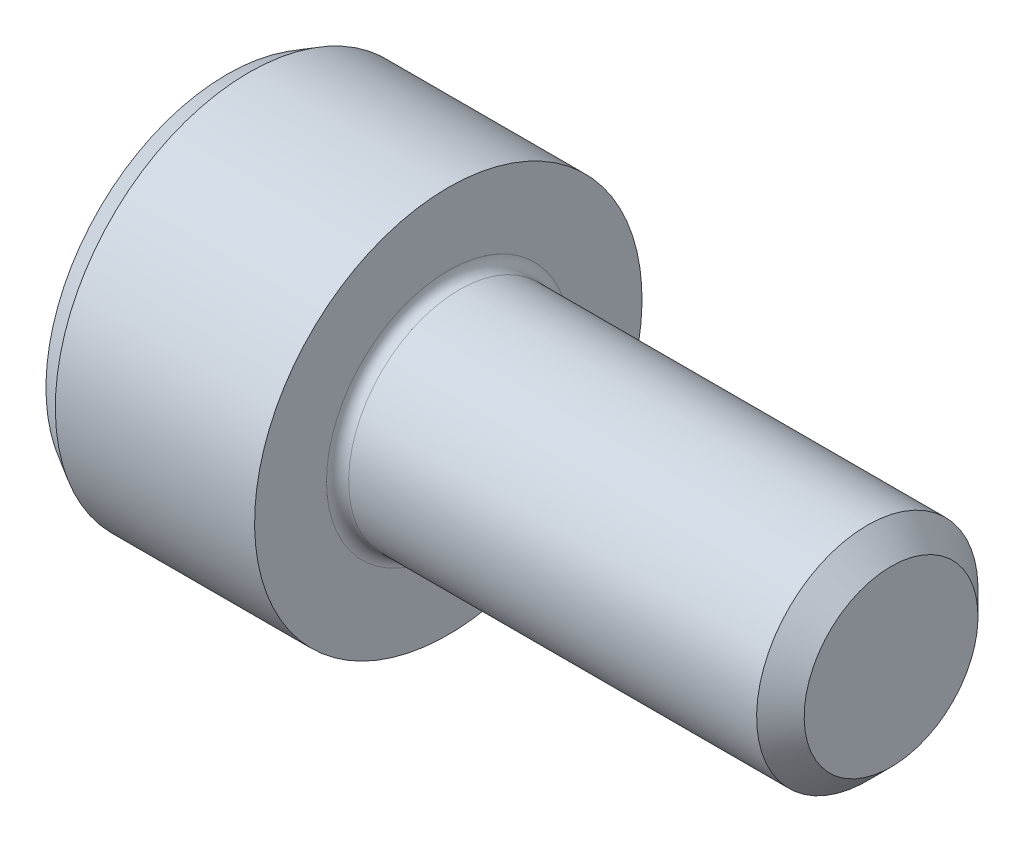
ISO-10303-21;
HEADER;
FILE_DESCRIPTION(('STEP AP214'),'2;1');
FILE_NAME('part.step','',(''),(''),'','','');
FILE_SCHEMA(('AUTOMOTIVE_DESIGN { 1 0 10303 214 1 1 1 1 }'));
ENDSEC;
DATA;
#1=APPLICATION_CONTEXT('core data for automotive mechanical design processes');
#2=APPLICATION_PROTOCOL_DEFINITION('international standard','automotive_design',2000,#1);
#3=PRODUCT_CONTEXT('',#1,'mechanical');
#4=PRODUCT('Part','Part','',(#3));
#5=PRODUCT_RELATED_PRODUCT_CATEGORY('part','',(#4));
#6=PRODUCT_DEFINITION_FORMATION('','',#4);
#7=PRODUCT_DEFINITION_CONTEXT('part definition',#1,'design');
#8=PRODUCT_DEFINITION('design','',#6,#7);
#9=PRODUCT_DEFINITION_SHAPE('','',#8);
#10=(LENGTH_UNIT() NAMED_UNIT(*) SI_UNIT(.MILLI.,.METRE.));
#11=(NAMED_UNIT(*) PLANE_ANGLE_UNIT() SI_UNIT($,.RADIAN.));
#12=(NAMED_UNIT(*) SI_UNIT($,.STERADIAN.) SOLID_ANGLE_UNIT());
#13=UNCERTAINTY_MEASURE_WITH_UNIT(LENGTH_MEASURE(1.E-05),#10,'distance_accuracy_value','');
#14=(GEOMETRIC_REPRESENTATION_CONTEXT(3) GLOBAL_UNCERTAINTY_ASSIGNED_CONTEXT((#13)) GLOBAL_UNIT_ASSIGNED_CONTEXT((#10,
#11,#12)) REPRESENTATION_CONTEXT('',''));
#15=CARTESIAN_POINT('',(0.,0.,0.));
#16=DIRECTION('',(0.,0.,1.));
#17=DIRECTION('',(1.,0.,0.));
#18=AXIS2_PLACEMENT_3D('',#15,#16,#17);
#19=CARTESIAN_POINT('',(0.,3.5,0.));
#20=DIRECTION('',(-1.,0.,0.));
#21=DIRECTION('',(0.,0.,1.));
#22=AXIS2_PLACEMENT_3D('',#19,#20,#21);
#23=PLANE('',#22);
#24=CARTESIAN_POINT('',(0.,0.,0.));
#25=DIRECTION('',(1.,0.,0.));
#26=DIRECTION('',(0.,1.,0.));
#27=AXIS2_PLACEMENT_3D('',#24,#25,#26);
#28=CIRCLE('',#27,2.2);
#29=CARTESIAN_POINT('',(0.,2.2,0.));
#30=VERTEX_POINT('',#29);
#31=EDGE_CURVE('E10',#30,#30,#28,.T.);
#32=ORIENTED_EDGE('',*,*,#31,.F.);
#33=EDGE_LOOP('',(#32));
#34=FACE_BOUND('',#33,.T.);
#35=CARTESIAN_POINT('',(0.,0.,0.));
#36=DIRECTION('',(1.,0.,0.));
#37=DIRECTION('',(0.,1.,0.));
#38=AXIS2_PLACEMENT_3D('',#35,#36,#37);
#39=CIRCLE('',#38,3.5);
#40=CARTESIAN_POINT('',(0.,3.5,0.));
#41=VERTEX_POINT('',#40);
#42=EDGE_CURVE('E213',#41,#41,#39,.T.);
#43=ORIENTED_EDGE('',*,*,#42,.T.);
#44=EDGE_LOOP('',(#43));
#45=FACE_BOUND('',#44,.T.);
#46=ADVANCED_FACE('F16',(#34,#45),#23,.F.);
#47=CARTESIAN_POINT('',(0.2,0.,0.));
#48=DIRECTION('',(1.,0.,0.));
#49=DIRECTION('',(0.,1.,0.));
#50=AXIS2_PLACEMENT_3D('',#47,#48,#49);
#51=TOROIDAL_SURFACE('',#50,2.2,0.2);
#52=CARTESIAN_POINT('',(0.2,0.,0.));
#53=DIRECTION('',(1.,0.,0.));
#54=DIRECTION('',(0.,1.,0.));
#55=AXIS2_PLACEMENT_3D('',#52,#53,#54);
#56=CIRCLE('',#55,2.);
#57=CARTESIAN_POINT('',(0.2,2.,0.));
#58=VERTEX_POINT('',#57);
#59=EDGE_CURVE('E27',#58,#58,#56,.T.);
#60=ORIENTED_EDGE('',*,*,#59,.F.);
#61=EDGE_LOOP('',(#60));
#62=FACE_BOUND('',#61,.T.);
#63=ORIENTED_EDGE('',*,*,#31,.T.);
#64=EDGE_LOOP('',(#63));
#65=FACE_BOUND('',#64,.T.);
#66=ADVANCED_FACE('F380',(#62,#65),#51,.F.);
#67=CARTESIAN_POINT('',(8.,0.,0.));
#68=DIRECTION('',(-1.,0.,0.));
#69=DIRECTION('',(0.,1.,0.));
#70=AXIS2_PLACEMENT_3D('',#67,#68,#69);
#71=CYLINDRICAL_SURFACE('',#70,2.);
#72=CARTESIAN_POINT('',(7.5705,0.,0.));
#73=DIRECTION('',(1.,0.,0.));
#74=DIRECTION('',(0.,1.,0.));
#75=AXIS2_PLACEMENT_3D('',#72,#73,#74);
#76=CIRCLE('',#75,2.);
#77=CARTESIAN_POINT('',(7.5705,2.,0.));
#78=VERTEX_POINT('',#77);
#79=EDGE_CURVE('E180',#78,#78,#76,.T.);
#80=ORIENTED_EDGE('',*,*,#79,.F.);
#81=EDGE_LOOP('',(#80));
#82=FACE_BOUND('',#81,.T.);
#83=ORIENTED_EDGE('',*,*,#59,.T.);
#84=EDGE_LOOP('',(#83));
#85=FACE_BOUND('',#84,.T.);
#86=ADVANCED_FACE('F386',(#82,#85),#71,.T.);
#87=CARTESIAN_POINT('',(7.5705,0.,0.));
#88=DIRECTION('',(-1.,0.,0.));
#89=DIRECTION('',(0.,-1.,0.));
#90=AXIS2_PLACEMENT_3D('',#87,#88,#89);
#91=CONICAL_SURFACE('',#90,2.,0.785398163397447);
#92=CARTESIAN_POINT('',(8.,0.,0.));
#93=DIRECTION('',(1.,0.,0.));
#94=DIRECTION('',(0.,1.,0.));
#95=AXIS2_PLACEMENT_3D('',#92,#93,#94);
#96=CIRCLE('',#95,1.5705);
#97=CARTESIAN_POINT('',(8.,1.5705,0.));
#98=VERTEX_POINT('',#97);
#99=EDGE_CURVE('E153',#98,#98,#96,.T.);
#100=ORIENTED_EDGE('',*,*,#99,.F.);
#101=EDGE_LOOP('',(#100));
#102=FACE_BOUND('',#101,.T.);
#103=ORIENTED_EDGE('',*,*,#79,.T.);
#104=EDGE_LOOP('',(#103));
#105=FACE_BOUND('',#104,.T.);
#106=ADVANCED_FACE('F412',(#102,#105),#91,.T.);
#107=CARTESIAN_POINT('',(8.,1.5705,0.));
#108=DIRECTION('',(-1.,0.,0.));
#109=DIRECTION('',(0.,0.,1.));
#110=AXIS2_PLACEMENT_3D('',#107,#108,#109);
#111=PLANE('',#110);
#112=ORIENTED_EDGE('',*,*,#99,.T.);
#113=EDGE_LOOP('',(#112));
#114=FACE_BOUND('',#113,.T.);
#115=ADVANCED_FACE('F398',(#114),#111,.F.);
#116=CARTESIAN_POINT('',(-2.,0.,0.));
#117=DIRECTION('',(-1.,0.,0.));
#118=DIRECTION('',(0.,0.,1.));
#119=AXIS2_PLACEMENT_3D('',#116,#117,#118);
#120=CONICAL_SURFACE('',#119,1.5,1.0471975511966);
#121=CARTESIAN_POINT('',(-1.13397459621555,0.,0.));
#122=VERTEX_POINT('',#121);
#123=VERTEX_LOOP('',#122);
#124=FACE_BOUND('',#123,.T.);
#125=CARTESIAN_POINT('',(-2.,0.,0.));
#126=DIRECTION('',(1.,0.,0.));
#127=DIRECTION('',(0.,0.,-1.));
#128=AXIS2_PLACEMENT_3D('',#125,#126,#127);
#129=CIRCLE('',#128,1.5);
#130=CARTESIAN_POINT('',(-2.,1.29903810567666,-0.75));
#131=VERTEX_POINT('',#130);
#132=CARTESIAN_POINT('',(-2.,1.29903810567666,0.75));
#133=VERTEX_POINT('',#132);
#134=EDGE_CURVE('E179',#131,#133,#129,.T.);
#135=ORIENTED_EDGE('',*,*,#134,.F.);
#136=CARTESIAN_POINT('',(-2.,0.,0.));
#137=DIRECTION('',(1.,0.,0.));
#138=DIRECTION('',(0.,0.,-1.));
#139=AXIS2_PLACEMENT_3D('',#136,#137,#138);
#140=CIRCLE('',#139,1.5);
#141=CARTESIAN_POINT('',(-2.,0.,-1.5));
#142=VERTEX_POINT('',#141);
#143=EDGE_CURVE('E20',#142,#131,#140,.T.);
#144=ORIENTED_EDGE('',*,*,#143,.F.);
#145=CARTESIAN_POINT('',(-2.,0.,0.));
#146=DIRECTION('',(1.,0.,0.));
#147=DIRECTION('',(0.,0.,-1.));
#148=AXIS2_PLACEMENT_3D('',#145,#146,#147);
#149=CIRCLE('',#148,1.5);
#150=CARTESIAN_POINT('',(-2.,-1.29903810567666,-0.75));
#151=VERTEX_POINT('',#150);
#152=EDGE_CURVE('E178',#151,#142,#149,.T.);
#153=ORIENTED_EDGE('',*,*,#152,.F.);
#154=CARTESIAN_POINT('',(-2.,0.,0.));
#155=DIRECTION('',(1.,0.,0.));
#156=DIRECTION('',(0.,0.,-1.));
#157=AXIS2_PLACEMENT_3D('',#154,#155,#156);
#158=CIRCLE('',#157,1.5);
#159=CARTESIAN_POINT('',(-2.,-1.29903810567666,0.75));
#160=VERTEX_POINT('',#159);
#161=EDGE_CURVE('E167',#160,#151,#158,.T.);
#162=ORIENTED_EDGE('',*,*,#161,.F.);
#163=CARTESIAN_POINT('',(-2.,0.,0.));
#164=DIRECTION('',(1.,0.,0.));
#165=DIRECTION('',(0.,0.,-1.));
#166=AXIS2_PLACEMENT_3D('',#163,#164,#165);
#167=CIRCLE('',#166,1.5);
#168=CARTESIAN_POINT('',(-2.,0.,1.5));
#169=VERTEX_POINT('',#168);
#170=EDGE_CURVE('E177',#169,#160,#167,.T.);
#171=ORIENTED_EDGE('',*,*,#170,.F.);
#172=CARTESIAN_POINT('',(-2.,0.,0.));
#173=DIRECTION('',(1.,0.,0.));
#174=DIRECTION('',(0.,0.,-1.));
#175=AXIS2_PLACEMENT_3D('',#172,#173,#174);
#176=CIRCLE('',#175,1.5);
#177=EDGE_CURVE('E218',#133,#169,#176,.T.);
#178=ORIENTED_EDGE('',*,*,#177,.F.);
#179=EDGE_LOOP('',(#135,#144,#153,#162,#171,#178));
#180=FACE_BOUND('',#179,.T.);
#181=ADVANCED_FACE('F312',(#124,#180),#120,.F.);
#182=CARTESIAN_POINT('',(-2.,-0.866025403784439,-1.5));
#183=DIRECTION('',(0.,0.,1.));
#184=DIRECTION('',(1.,0.,0.));
#185=AXIS2_PLACEMENT_3D('',#182,#183,#184);
#186=PLANE('',#185);
#187=DIRECTION('',(0.,1.,0.));
#188=VECTOR('',#187,1.);
#189=CARTESIAN_POINT('',(-4.,-0.866025403784439,-1.5));
#190=LINE('',#189,#188);
#191=CARTESIAN_POINT('',(-4.,-0.866025403784439,-1.5));
#192=VERTEX_POINT('',#191);
#193=CARTESIAN_POINT('',(-4.,0.866025403784438,-1.5));
#194=VERTEX_POINT('',#193);
#195=EDGE_CURVE('E235',#192,#194,#190,.T.);
#196=ORIENTED_EDGE('',*,*,#195,.F.);
#197=DIRECTION('',(-1.,0.,0.));
#198=VECTOR('',#197,1.);
#199=CARTESIAN_POINT('',(-2.,-0.866025403784439,-1.5));
#200=LINE('',#199,#198);
#201=CARTESIAN_POINT('',(-2.,-0.866025403784439,-1.5));
#202=VERTEX_POINT('',#201);
#203=EDGE_CURVE('E173',#202,#192,#200,.T.);
#204=ORIENTED_EDGE('',*,*,#203,.F.);
#205=DIRECTION('',(0.,1.,0.));
#206=VECTOR('',#205,1.);
#207=CARTESIAN_POINT('',(-2.,-0.866025403784439,-1.5));
#208=LINE('',#207,#206);
#209=EDGE_CURVE('E148',#202,#142,#208,.T.);
#210=ORIENTED_EDGE('',*,*,#209,.T.);
#211=DIRECTION('',(0.,1.,0.));
#212=VECTOR('',#211,1.);
#213=CARTESIAN_POINT('',(-2.,-0.866025403784439,-1.5));
#214=LINE('',#213,#212);
#215=CARTESIAN_POINT('',(-2.,0.866025403784438,-1.5));
#216=VERTEX_POINT('',#215);
#217=EDGE_CURVE('E144',#142,#216,#214,.T.);
#218=ORIENTED_EDGE('',*,*,#217,.T.);
#219=DIRECTION('',(-1.,0.,0.));
#220=VECTOR('',#219,1.);
#221=CARTESIAN_POINT('',(-2.,0.866025403784438,-1.5));
#222=LINE('',#221,#220);
#223=EDGE_CURVE('E101',#216,#194,#222,.T.);
#224=ORIENTED_EDGE('',*,*,#223,.T.);
#225=EDGE_LOOP('',(#196,#204,#210,#218,#224));
#226=FACE_BOUND('',#225,.T.);
#227=ADVANCED_FACE('F146',(#226),#186,.T.);
#228=CARTESIAN_POINT('',(-2.,0.,0.));
#229=DIRECTION('',(1.,0.,0.));
#230=DIRECTION('',(0.,1.,0.));
#231=AXIS2_PLACEMENT_3D('',#228,#229,#230);
#232=PLANE('',#231);
#233=ORIENTED_EDGE('',*,*,#143,.T.);
#234=DIRECTION('',(0.,0.5,0.866025403784439));
#235=VECTOR('',#234,1.);
#236=CARTESIAN_POINT('',(-2.,0.866025403784439,-1.5));
#237=LINE('',#236,#235);
#238=EDGE_CURVE('E156',#216,#131,#237,.T.);
#239=ORIENTED_EDGE('',*,*,#238,.F.);
#240=ORIENTED_EDGE('',*,*,#217,.F.);
#241=EDGE_LOOP('',(#233,#239,#240));
#242=FACE_BOUND('',#241,.T.);
#243=ADVANCED_FACE('F157',(#242),#232,.F.);
#244=CARTESIAN_POINT('',(-2.,0.,0.));
#245=DIRECTION('',(1.,0.,0.));
#246=DIRECTION('',(0.,1.,0.));
#247=AXIS2_PLACEMENT_3D('',#244,#245,#246);
#248=PLANE('',#247);
#249=ORIENTED_EDGE('',*,*,#152,.T.);
#250=ORIENTED_EDGE('',*,*,#209,.F.);
#251=DIRECTION('',(0.,0.5,-0.866025403784439));
#252=VECTOR('',#251,1.);
#253=CARTESIAN_POINT('',(-2.,-1.73205080756888,0.));
#254=LINE('',#253,#252);
#255=EDGE_CURVE('E257',#151,#202,#254,.T.);
#256=ORIENTED_EDGE('',*,*,#255,.F.);
#257=EDGE_LOOP('',(#249,#250,#256));
#258=FACE_BOUND('',#257,.T.);
#259=ADVANCED_FACE('F367',(#258),#248,.F.);
#260=CARTESIAN_POINT('',(-2.,0.,0.));
#261=DIRECTION('',(1.,0.,0.));
#262=DIRECTION('',(0.,1.,0.));
#263=AXIS2_PLACEMENT_3D('',#260,#261,#262);
#264=PLANE('',#263);
#265=ORIENTED_EDGE('',*,*,#170,.T.);
#266=DIRECTION('',(0.,-0.5,-0.866025403784439));
#267=VECTOR('',#266,1.);
#268=CARTESIAN_POINT('',(-2.,-0.866025403784439,1.5));
#269=LINE('',#268,#267);
#270=CARTESIAN_POINT('',(-2.,-0.866025403784438,1.5));
#271=VERTEX_POINT('',#270);
#272=EDGE_CURVE('E208',#271,#160,#269,.T.);
#273=ORIENTED_EDGE('',*,*,#272,.F.);
#274=DIRECTION('',(0.,-1.,0.));
#275=VECTOR('',#274,1.);
#276=CARTESIAN_POINT('',(-2.,0.866025403784439,1.5));
#277=LINE('',#276,#275);
#278=EDGE_CURVE('E229',#169,#271,#277,.T.);
#279=ORIENTED_EDGE('',*,*,#278,.F.);
#280=EDGE_LOOP('',(#265,#273,#279));
#281=FACE_BOUND('',#280,.T.);
#282=ADVANCED_FACE('F291',(#281),#264,.F.);
#283=CARTESIAN_POINT('',(-2.,0.,0.));
#284=DIRECTION('',(1.,0.,0.));
#285=DIRECTION('',(0.,1.,0.));
#286=AXIS2_PLACEMENT_3D('',#283,#284,#285);
#287=PLANE('',#286);
#288=DIRECTION('',(0.,0.5,0.866025403784439));
#289=VECTOR('',#288,1.);
#290=CARTESIAN_POINT('',(-2.,0.866025403784439,-1.5));
#291=LINE('',#290,#289);
#292=CARTESIAN_POINT('',(-2.,1.73205080756888,0.));
#293=VERTEX_POINT('',#292);
#294=EDGE_CURVE('E160',#131,#293,#291,.T.);
#295=ORIENTED_EDGE('',*,*,#294,.F.);
#296=ORIENTED_EDGE('',*,*,#134,.T.);
#297=DIRECTION('',(0.,-0.5,0.866025403784439));
#298=VECTOR('',#297,1.);
#299=CARTESIAN_POINT('',(-2.,1.73205080756888,0.));
#300=LINE('',#299,#298);
#301=EDGE_CURVE('E243',#293,#133,#300,.T.);
#302=ORIENTED_EDGE('',*,*,#301,.F.);
#303=EDGE_LOOP('',(#295,#296,#302));
#304=FACE_BOUND('',#303,.T.);
#305=ADVANCED_FACE('F375',(#304),#287,.F.);
#306=CARTESIAN_POINT('',(-2.,0.866025403784439,-1.5));
#307=DIRECTION('',(0.,-0.866025403784439,0.5));
#308=DIRECTION('',(-1.,0.,0.));
#309=AXIS2_PLACEMENT_3D('',#306,#307,#308);
#310=PLANE('',#309);
#311=DIRECTION('',(0.,0.5,0.866025403784439));
#312=VECTOR('',#311,1.);
#313=CARTESIAN_POINT('',(-4.,0.866025403784439,-1.5));
#314=LINE('',#313,#312);
#315=CARTESIAN_POINT('',(-4.,1.73205080756888,0.));
#316=VERTEX_POINT('',#315);
#317=EDGE_CURVE('E164',#194,#316,#314,.T.);
#318=ORIENTED_EDGE('',*,*,#317,.F.);
#319=ORIENTED_EDGE('',*,*,#223,.F.);
#320=ORIENTED_EDGE('',*,*,#238,.T.);
#321=ORIENTED_EDGE('',*,*,#294,.T.);
#322=DIRECTION('',(-1.,0.,0.));
#323=VECTOR('',#322,1.);
#324=CARTESIAN_POINT('',(-2.,1.73205080756888,0.));
#325=LINE('',#324,#323);
#326=EDGE_CURVE('E91',#293,#316,#325,.T.);
#327=ORIENTED_EDGE('',*,*,#326,.T.);
#328=EDGE_LOOP('',(#318,#319,#320,#321,#327));
#329=FACE_BOUND('',#328,.T.);
#330=ADVANCED_FACE('F162',(#329),#310,.T.);
#331=CARTESIAN_POINT('',(-2.,0.,0.));
#332=DIRECTION('',(1.,0.,0.));
#333=DIRECTION('',(0.,1.,0.));
#334=AXIS2_PLACEMENT_3D('',#331,#332,#333);
#335=PLANE('',#334);
#336=ORIENTED_EDGE('',*,*,#161,.T.);
#337=DIRECTION('',(0.,0.5,-0.866025403784439));
#338=VECTOR('',#337,1.);
#339=CARTESIAN_POINT('',(-2.,-1.73205080756888,0.));
#340=LINE('',#339,#338);
#341=CARTESIAN_POINT('',(-2.,-1.73205080756888,0.));
#342=VERTEX_POINT('',#341);
#343=EDGE_CURVE('E217',#342,#151,#340,.T.);
#344=ORIENTED_EDGE('',*,*,#343,.F.);
#345=DIRECTION('',(0.,-0.5,-0.866025403784439));
#346=VECTOR('',#345,1.);
#347=CARTESIAN_POINT('',(-2.,-0.866025403784439,1.5));
#348=LINE('',#347,#346);
#349=EDGE_CURVE('E212',#160,#342,#348,.T.);
#350=ORIENTED_EDGE('',*,*,#349,.F.);
#351=EDGE_LOOP('',(#336,#344,#350));
#352=FACE_BOUND('',#351,.T.);
#353=ADVANCED_FACE('F317',(#352),#335,.F.);
#354=CARTESIAN_POINT('',(-2.,-1.73205080756888,0.));
#355=DIRECTION('',(0.,0.866025403784439,0.5));
#356=DIRECTION('',(1.,0.,0.));
#357=AXIS2_PLACEMENT_3D('',#354,#355,#356);
#358=PLANE('',#357);
#359=DIRECTION('',(0.,0.5,-0.866025403784439));
#360=VECTOR('',#359,1.);
#361=CARTESIAN_POINT('',(-4.,-1.73205080756888,0.));
#362=LINE('',#361,#360);
#363=CARTESIAN_POINT('',(-4.,-1.73205080756888,0.));
#364=VERTEX_POINT('',#363);
#365=EDGE_CURVE('E201',#364,#192,#362,.T.);
#366=ORIENTED_EDGE('',*,*,#365,.F.);
#367=DIRECTION('',(-1.,0.,0.));
#368=VECTOR('',#367,1.);
#369=CARTESIAN_POINT('',(-2.,-1.73205080756888,0.));
#370=LINE('',#369,#368);
#371=EDGE_CURVE('E214',#342,#364,#370,.T.);
#372=ORIENTED_EDGE('',*,*,#371,.F.);
#373=ORIENTED_EDGE('',*,*,#343,.T.);
#374=ORIENTED_EDGE('',*,*,#255,.T.);
#375=ORIENTED_EDGE('',*,*,#203,.T.);
#376=EDGE_LOOP('',(#366,#372,#373,#374,#375));
#377=FACE_BOUND('',#376,.T.);
#378=ADVANCED_FACE('F359',(#377),#358,.T.);
#379=CARTESIAN_POINT('',(-2.,-0.866025403784439,1.5));
#380=DIRECTION('',(0.,0.866025403784439,-0.5));
#381=DIRECTION('',(-1.,0.,0.));
#382=AXIS2_PLACEMENT_3D('',#379,#380,#381);
#383=PLANE('',#382);
#384=DIRECTION('',(0.,-0.5,-0.866025403784439));
#385=VECTOR('',#384,1.);
#386=CARTESIAN_POINT('',(-4.,-0.866025403784439,1.5));
#387=LINE('',#386,#385);
#388=CARTESIAN_POINT('',(-4.,-0.866025403784438,1.5));
#389=VERTEX_POINT('',#388);
#390=EDGE_CURVE('E198',#389,#364,#387,.T.);
#391=ORIENTED_EDGE('',*,*,#390,.F.);
#392=DIRECTION('',(-1.,0.,0.));
#393=VECTOR('',#392,1.);
#394=CARTESIAN_POINT('',(-2.,-0.866025403784438,1.5));
#395=LINE('',#394,#393);
#396=EDGE_CURVE('E226',#271,#389,#395,.T.);
#397=ORIENTED_EDGE('',*,*,#396,.F.);
#398=ORIENTED_EDGE('',*,*,#272,.T.);
#399=ORIENTED_EDGE('',*,*,#349,.T.);
#400=ORIENTED_EDGE('',*,*,#371,.T.);
#401=EDGE_LOOP('',(#391,#397,#398,#399,#400));
#402=FACE_BOUND('',#401,.T.);
#403=ADVANCED_FACE('F295',(#402),#383,.T.);
#404=CARTESIAN_POINT('',(-4.,0.,0.));
#405=DIRECTION('',(1.,0.,0.));
#406=DIRECTION('',(0.,1.,0.));
#407=AXIS2_PLACEMENT_3D('',#404,#405,#406);
#408=CONICAL_SURFACE('',#407,3.26905989232415,0.523598775598277);
#409=CARTESIAN_POINT('',(-4.,0.,0.));
#410=DIRECTION('',(1.,0.,0.));
#411=DIRECTION('',(0.,1.,0.));
#412=AXIS2_PLACEMENT_3D('',#409,#410,#411);
#413=CIRCLE('',#412,3.26905989232415);
#414=CARTESIAN_POINT('',(-4.,3.26905989232416,0.));
#415=VERTEX_POINT('',#414);
#416=EDGE_CURVE('E202',#415,#415,#413,.T.);
#417=ORIENTED_EDGE('',*,*,#416,.T.);
#418=EDGE_LOOP('',(#417));
#419=FACE_BOUND('',#418,.T.);
#420=CARTESIAN_POINT('',(-3.6,0.,0.));
#421=DIRECTION('',(1.,0.,0.));
#422=DIRECTION('',(0.,1.,0.));
#423=AXIS2_PLACEMENT_3D('',#420,#421,#422);
#424=CIRCLE('',#423,3.5);
#425=CARTESIAN_POINT('',(-3.6,3.5,0.));
#426=VERTEX_POINT('',#425);
#427=EDGE_CURVE('E228',#426,#426,#424,.T.);
#428=ORIENTED_EDGE('',*,*,#427,.F.);
#429=EDGE_LOOP('',(#428));
#430=FACE_BOUND('',#429,.T.);
#431=ADVANCED_FACE('F393',(#419,#430),#408,.T.);
#432=CARTESIAN_POINT('',(8.,0.,0.));
#433=DIRECTION('',(-1.,0.,0.));
#434=DIRECTION('',(0.,1.,0.));
#435=AXIS2_PLACEMENT_3D('',#432,#433,#434);
#436=CYLINDRICAL_SURFACE('',#435,3.5);
#437=ORIENTED_EDGE('',*,*,#42,.F.);
#438=EDGE_LOOP('',(#437));
#439=FACE_BOUND('',#438,.T.);
#440=ORIENTED_EDGE('',*,*,#427,.T.);
#441=EDGE_LOOP('',(#440));
#442=FACE_BOUND('',#441,.T.);
#443=ADVANCED_FACE('F407',(#439,#442),#436,.T.);
#444=CARTESIAN_POINT('',(-2.,0.866025403784439,1.5));
#445=DIRECTION('',(0.,0.,-1.));
#446=DIRECTION('',(0.,-1.,0.));
#447=AXIS2_PLACEMENT_3D('',#444,#445,#446);
#448=PLANE('',#447);
#449=DIRECTION('',(0.,-1.,0.));
#450=VECTOR('',#449,1.);
#451=CARTESIAN_POINT('',(-4.,0.866025403784439,1.5));
#452=LINE('',#451,#450);
#453=CARTESIAN_POINT('',(-4.,0.866025403784439,1.5));
#454=VERTEX_POINT('',#453);
#455=EDGE_CURVE('E203',#454,#389,#452,.T.);
#456=ORIENTED_EDGE('',*,*,#455,.F.);
#457=DIRECTION('',(-1.,0.,0.));
#458=VECTOR('',#457,1.);
#459=CARTESIAN_POINT('',(-2.,0.866025403784439,1.5));
#460=LINE('',#459,#458);
#461=CARTESIAN_POINT('',(-2.,0.866025403784439,1.5));
#462=VERTEX_POINT('',#461);
#463=EDGE_CURVE('E222',#462,#454,#460,.T.);
#464=ORIENTED_EDGE('',*,*,#463,.F.);
#465=DIRECTION('',(0.,-1.,0.));
#466=VECTOR('',#465,1.);
#467=CARTESIAN_POINT('',(-2.,0.866025403784439,1.5));
#468=LINE('',#467,#466);
#469=EDGE_CURVE('E221',#462,#169,#468,.T.);
#470=ORIENTED_EDGE('',*,*,#469,.T.);
#471=ORIENTED_EDGE('',*,*,#278,.T.);
#472=ORIENTED_EDGE('',*,*,#396,.T.);
#473=EDGE_LOOP('',(#456,#464,#470,#471,#472));
#474=FACE_BOUND('',#473,.T.);
#475=ADVANCED_FACE('F286',(#474),#448,.T.);
#476=CARTESIAN_POINT('',(-2.,0.,0.));
#477=DIRECTION('',(1.,0.,0.));
#478=DIRECTION('',(0.,1.,0.));
#479=AXIS2_PLACEMENT_3D('',#476,#477,#478);
#480=PLANE('',#479);
#481=ORIENTED_EDGE('',*,*,#177,.T.);
#482=ORIENTED_EDGE('',*,*,#469,.F.);
#483=DIRECTION('',(0.,-0.5,0.866025403784439));
#484=VECTOR('',#483,1.);
#485=CARTESIAN_POINT('',(-2.,1.73205080756888,0.));
#486=LINE('',#485,#484);
#487=EDGE_CURVE('E197',#133,#462,#486,.T.);
#488=ORIENTED_EDGE('',*,*,#487,.F.);
#489=EDGE_LOOP('',(#481,#482,#488));
#490=FACE_BOUND('',#489,.T.);
#491=ADVANCED_FACE('F18',(#490),#480,.F.);
#492=CARTESIAN_POINT('',(-2.,1.73205080756888,0.));
#493=DIRECTION('',(0.,-0.866025403784439,-0.5));
#494=DIRECTION('',(0.,0.5,-0.866025403784439));
#495=AXIS2_PLACEMENT_3D('',#492,#493,#494);
#496=PLANE('',#495);
#497=DIRECTION('',(0.,-0.5,0.866025403784439));
#498=VECTOR('',#497,1.);
#499=CARTESIAN_POINT('',(-4.,1.73205080756888,0.));
#500=LINE('',#499,#498);
#501=EDGE_CURVE('E207',#316,#454,#500,.T.);
#502=ORIENTED_EDGE('',*,*,#501,.F.);
#503=ORIENTED_EDGE('',*,*,#326,.F.);
#504=ORIENTED_EDGE('',*,*,#301,.T.);
#505=ORIENTED_EDGE('',*,*,#487,.T.);
#506=ORIENTED_EDGE('',*,*,#463,.T.);
#507=EDGE_LOOP('',(#502,#503,#504,#505,#506));
#508=FACE_BOUND('',#507,.T.);
#509=ADVANCED_FACE('F304',(#508),#496,.T.);
#510=CARTESIAN_POINT('',(-4.,0.,0.));
#511=DIRECTION('',(1.,0.,0.));
#512=DIRECTION('',(0.,-1.,0.));
#513=AXIS2_PLACEMENT_3D('',#510,#511,#512);
#514=PLANE('',#513);
#515=ORIENTED_EDGE('',*,*,#390,.T.);
#516=ORIENTED_EDGE('',*,*,#365,.T.);
#517=ORIENTED_EDGE('',*,*,#195,.T.);
#518=ORIENTED_EDGE('',*,*,#317,.T.);
#519=ORIENTED_EDGE('',*,*,#501,.T.);
#520=ORIENTED_EDGE('',*,*,#455,.T.);
#521=EDGE_LOOP('',(#515,#516,#517,#518,#519,#520));
#522=FACE_BOUND('',#521,.T.);
#523=ORIENTED_EDGE('',*,*,#416,.F.);
#524=EDGE_LOOP('',(#523));
#525=FACE_BOUND('',#524,.T.);
#526=ADVANCED_FACE('F299',(#522,#525),#514,.F.);
#527=CLOSED_SHELL('',(#46,#66,#86,#106,#115,#181,#227,#243,#259,#282,#305,#330,#353,#378,#403,
#431,#443,#475,#491,#509,#526));
#528=MANIFOLD_SOLID_BREP('B1',#527);
#529=ADVANCED_BREP_SHAPE_REPRESENTATION('',(#18,#528),#14);
#530=SHAPE_DEFINITION_REPRESENTATION(#9,#529);
ENDSEC;
END-ISO-10303-21;
